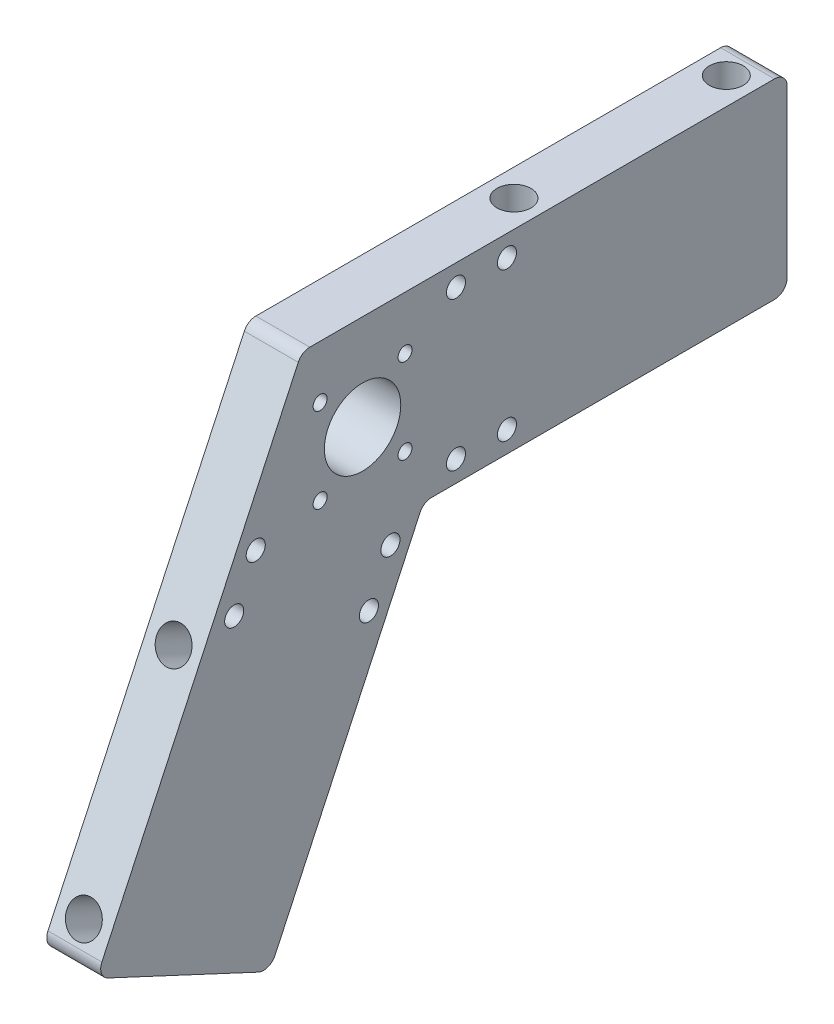
ISO-10303-21;
HEADER;
FILE_DESCRIPTION(('STEP AP214'),'2;1');
FILE_NAME('part.step','',(''),(''),'','','');
FILE_SCHEMA(('AUTOMOTIVE_DESIGN { 1 0 10303 214 1 1 1 1 }'));
ENDSEC;
DATA;
#1=APPLICATION_CONTEXT('core data for automotive mechanical design processes');
#2=APPLICATION_PROTOCOL_DEFINITION('international standard','automotive_design',2000,#1);
#3=PRODUCT_CONTEXT('',#1,'mechanical');
#4=PRODUCT('Part','Part','',(#3));
#5=PRODUCT_RELATED_PRODUCT_CATEGORY('part','',(#4));
#6=PRODUCT_DEFINITION_FORMATION('','',#4);
#7=PRODUCT_DEFINITION_CONTEXT('part definition',#1,'design');
#8=PRODUCT_DEFINITION('design','',#6,#7);
#9=PRODUCT_DEFINITION_SHAPE('','',#8);
#10=(LENGTH_UNIT() NAMED_UNIT(*) SI_UNIT(.MILLI.,.METRE.));
#11=(NAMED_UNIT(*) PLANE_ANGLE_UNIT() SI_UNIT($,.RADIAN.));
#12=(NAMED_UNIT(*) SI_UNIT($,.STERADIAN.) SOLID_ANGLE_UNIT());
#13=UNCERTAINTY_MEASURE_WITH_UNIT(LENGTH_MEASURE(1.E-05),#10,'distance_accuracy_value','');
#14=(GEOMETRIC_REPRESENTATION_CONTEXT(3) GLOBAL_UNCERTAINTY_ASSIGNED_CONTEXT((#13)) GLOBAL_UNIT_ASSIGNED_CONTEXT((#10,
#11,#12)) REPRESENTATION_CONTEXT('',''));
#15=CARTESIAN_POINT('',(0.,0.,0.));
#16=DIRECTION('',(0.,0.,1.));
#17=DIRECTION('',(1.,0.,0.));
#18=AXIS2_PLACEMENT_3D('',#15,#16,#17);
#19=CARTESIAN_POINT('',(6.35,22.5,14.3340808681685));
#20=DIRECTION('',(0.,-1.,0.));
#21=DIRECTION('',(0.,0.,-1.));
#22=AXIS2_PLACEMENT_3D('',#19,#20,#21);
#23=PLANE('',#22);
#24=DIRECTION('',(0.,0.,1.));
#25=VECTOR('',#24,1.);
#26=CARTESIAN_POINT('',(6.35,22.5,14.3340808681685));
#27=LINE('',#26,#25);
#28=CARTESIAN_POINT('',(6.35,22.5,-97.));
#29=VERTEX_POINT('',#28);
#30=CARTESIAN_POINT('',(6.35,22.5,12.4228700857461));
#31=VERTEX_POINT('',#30);
#32=EDGE_CURVE('E228',#29,#31,#27,.T.);
#33=ORIENTED_EDGE('',*,*,#32,.F.);
#34=DIRECTION('',(-1.,0.,0.));
#35=VECTOR('',#34,1.);
#36=CARTESIAN_POINT('',(6.35,22.5,-97.));
#37=LINE('',#36,#35);
#38=CARTESIAN_POINT('',(-6.35,22.5,-97.));
#39=VERTEX_POINT('',#38);
#40=EDGE_CURVE('E181',#29,#39,#37,.T.);
#41=ORIENTED_EDGE('',*,*,#40,.T.);
#42=DIRECTION('',(0.,0.,1.));
#43=VECTOR('',#42,1.);
#44=CARTESIAN_POINT('',(-6.35,22.5,14.3340808681685));
#45=LINE('',#44,#43);
#46=CARTESIAN_POINT('',(-6.35,22.5,12.4228700857461));
#47=VERTEX_POINT('',#46);
#48=EDGE_CURVE('E157',#39,#47,#45,.T.);
#49=ORIENTED_EDGE('',*,*,#48,.T.);
#50=DIRECTION('',(-1.,0.,0.));
#51=VECTOR('',#50,1.);
#52=CARTESIAN_POINT('',(6.35,22.5,12.4228700857461));
#53=LINE('',#52,#51);
#54=EDGE_CURVE('E179',#47,#31,#53,.F.);
#55=ORIENTED_EDGE('',*,*,#54,.T.);
#56=EDGE_LOOP('',(#33,#41,#49,#55));
#57=FACE_BOUND('',#56,.T.);
#58=CARTESIAN_POINT('',(0.,22.5,-42.));
#59=DIRECTION('',(0.,1.,0.));
#60=DIRECTION('',(0.,0.,1.));
#61=AXIS2_PLACEMENT_3D('',#58,#59,#60);
#62=CIRCLE('',#61,4.);
#63=CARTESIAN_POINT('',(0.,22.5,-38.));
#64=VERTEX_POINT('',#63);
#65=EDGE_CURVE('E252',#64,#64,#62,.T.);
#66=ORIENTED_EDGE('',*,*,#65,.F.);
#67=EDGE_LOOP('',(#66));
#68=FACE_BOUND('',#67,.T.);
#69=CARTESIAN_POINT('',(0.,22.5,-92.));
#70=DIRECTION('',(0.,1.,0.));
#71=DIRECTION('',(0.,0.,1.));
#72=AXIS2_PLACEMENT_3D('',#69,#70,#71);
#73=CIRCLE('',#72,4.);
#74=CARTESIAN_POINT('',(0.,22.5,-88.));
#75=VERTEX_POINT('',#74);
#76=EDGE_CURVE('E258',#75,#75,#73,.T.);
#77=ORIENTED_EDGE('',*,*,#76,.F.);
#78=EDGE_LOOP('',(#77));
#79=FACE_BOUND('',#78,.T.);
#80=ADVANCED_FACE('F37',(#57,#68,#79),#23,.F.);
#81=CARTESIAN_POINT('',(6.35,0.,0.));
#82=DIRECTION('',(-1.,0.,0.));
#83=DIRECTION('',(0.,0.,1.));
#84=AXIS2_PLACEMENT_3D('',#81,#82,#83);
#85=PLANE('',#84);
#86=CARTESIAN_POINT('',(6.35,-27.3345908952686,-6.56278451484589));
#87=DIRECTION('',(-1.,0.,0.));
#88=DIRECTION('',(0.,0.,1.));
#89=AXIS2_PLACEMENT_3D('',#86,#87,#88);
#90=CIRCLE('',#89,2.24999999999999);
#91=CARTESIAN_POINT('',(6.35,-27.3345908952686,-4.3127845148459));
#92=VERTEX_POINT('',#91);
#93=EDGE_CURVE('E339',#92,#92,#90,.T.);
#94=ORIENTED_EDGE('',*,*,#93,.T.);
#95=EDGE_LOOP('',(#94));
#96=FACE_BOUND('',#95,.T.);
#97=CARTESIAN_POINT('',(6.35,-38.2102843397084,-1.49136537395746));
#98=DIRECTION('',(-1.,0.,0.));
#99=DIRECTION('',(0.,0.,1.));
#100=AXIS2_PLACEMENT_3D('',#97,#98,#99);
#101=CIRCLE('',#100,2.24999999999999);
#102=CARTESIAN_POINT('',(6.35,-38.2102843397084,0.758634626042531));
#103=VERTEX_POINT('',#102);
#104=EDGE_CURVE('E333',#103,#103,#101,.T.);
#105=ORIENTED_EDGE('',*,*,#104,.T.);
#106=EDGE_LOOP('',(#105));
#107=FACE_BOUND('',#106,.T.);
#108=CARTESIAN_POINT('',(6.35,-12.5429517343439,25.1579880314368));
#109=DIRECTION('',(-1.,0.,0.));
#110=DIRECTION('',(0.,0.,1.));
#111=AXIS2_PLACEMENT_3D('',#108,#109,#110);
#112=CIRCLE('',#111,2.24999999999999);
#113=CARTESIAN_POINT('',(6.35,-12.5429517343439,27.4079880314368));
#114=VERTEX_POINT('',#113);
#115=EDGE_CURVE('E327',#114,#114,#112,.T.);
#116=ORIENTED_EDGE('',*,*,#115,.T.);
#117=EDGE_LOOP('',(#116));
#118=FACE_BOUND('',#117,.T.);
#119=CARTESIAN_POINT('',(6.35,-23.4186451787837,30.2294071723253));
#120=DIRECTION('',(-1.,0.,0.));
#121=DIRECTION('',(0.,0.,1.));
#122=AXIS2_PLACEMENT_3D('',#119,#120,#121);
#123=CIRCLE('',#122,2.24999999999999);
#124=CARTESIAN_POINT('',(6.35,-23.4186451787837,32.4794071723253));
#125=VERTEX_POINT('',#124);
#126=EDGE_CURVE('E321',#125,#125,#123,.T.);
#127=ORIENTED_EDGE('',*,*,#126,.T.);
#128=EDGE_LOOP('',(#127));
#129=FACE_BOUND('',#128,.T.);
#130=CARTESIAN_POINT('',(6.35,17.5,-22.));
#131=DIRECTION('',(-1.,0.,0.));
#132=DIRECTION('',(0.,0.,1.));
#133=AXIS2_PLACEMENT_3D('',#130,#131,#132);
#134=CIRCLE('',#133,2.24999999999999);
#135=CARTESIAN_POINT('',(6.35,17.5,-19.75));
#136=VERTEX_POINT('',#135);
#137=EDGE_CURVE('E315',#136,#136,#134,.T.);
#138=ORIENTED_EDGE('',*,*,#137,.T.);
#139=EDGE_LOOP('',(#138));
#140=FACE_BOUND('',#139,.T.);
#141=CARTESIAN_POINT('',(6.35,-17.5,-22.));
#142=DIRECTION('',(-1.,0.,0.));
#143=DIRECTION('',(0.,0.,1.));
#144=AXIS2_PLACEMENT_3D('',#141,#142,#143);
#145=CIRCLE('',#144,2.24999999999999);
#146=CARTESIAN_POINT('',(6.35,-17.5,-19.75));
#147=VERTEX_POINT('',#146);
#148=EDGE_CURVE('E309',#147,#147,#145,.T.);
#149=ORIENTED_EDGE('',*,*,#148,.T.);
#150=EDGE_LOOP('',(#149));
#151=FACE_BOUND('',#150,.T.);
#152=CARTESIAN_POINT('',(6.35,17.5,-34.));
#153=DIRECTION('',(-1.,0.,0.));
#154=DIRECTION('',(0.,0.,1.));
#155=AXIS2_PLACEMENT_3D('',#152,#153,#154);
#156=CIRCLE('',#155,2.24999999999999);
#157=CARTESIAN_POINT('',(6.35,17.5,-31.75));
#158=VERTEX_POINT('',#157);
#159=EDGE_CURVE('E303',#158,#158,#156,.T.);
#160=ORIENTED_EDGE('',*,*,#159,.T.);
#161=EDGE_LOOP('',(#160));
#162=FACE_BOUND('',#161,.T.);
#163=CARTESIAN_POINT('',(6.35,-17.5,-34.));
#164=DIRECTION('',(-1.,0.,0.));
#165=DIRECTION('',(0.,0.,1.));
#166=AXIS2_PLACEMENT_3D('',#163,#164,#165);
#167=CIRCLE('',#166,2.24999999999999);
#168=CARTESIAN_POINT('',(6.35,-17.5,-31.75));
#169=VERTEX_POINT('',#168);
#170=EDGE_CURVE('E297',#169,#169,#167,.T.);
#171=ORIENTED_EDGE('',*,*,#170,.T.);
#172=EDGE_LOOP('',(#171));
#173=FACE_BOUND('',#172,.T.);
#174=CARTESIAN_POINT('',(6.35,10.,10.));
#175=DIRECTION('',(-1.,0.,0.));
#176=DIRECTION('',(0.,0.,1.));
#177=AXIS2_PLACEMENT_3D('',#174,#175,#176);
#178=CIRCLE('',#177,1.65);
#179=CARTESIAN_POINT('',(6.35,10.,11.65));
#180=VERTEX_POINT('',#179);
#181=EDGE_CURVE('E291',#180,#180,#178,.T.);
#182=ORIENTED_EDGE('',*,*,#181,.T.);
#183=EDGE_LOOP('',(#182));
#184=FACE_BOUND('',#183,.T.);
#185=CARTESIAN_POINT('',(6.35,10.,-10.));
#186=DIRECTION('',(-1.,0.,0.));
#187=DIRECTION('',(0.,0.,1.));
#188=AXIS2_PLACEMENT_3D('',#185,#186,#187);
#189=CIRCLE('',#188,1.65);
#190=CARTESIAN_POINT('',(6.35,10.,-8.35));
#191=VERTEX_POINT('',#190);
#192=EDGE_CURVE('E285',#191,#191,#189,.T.);
#193=ORIENTED_EDGE('',*,*,#192,.T.);
#194=EDGE_LOOP('',(#193));
#195=FACE_BOUND('',#194,.T.);
#196=CARTESIAN_POINT('',(6.35,-10.,-10.));
#197=DIRECTION('',(-1.,0.,0.));
#198=DIRECTION('',(0.,0.,1.));
#199=AXIS2_PLACEMENT_3D('',#196,#197,#198);
#200=CIRCLE('',#199,1.65);
#201=CARTESIAN_POINT('',(6.35,-10.,-8.35));
#202=VERTEX_POINT('',#201);
#203=EDGE_CURVE('E279',#202,#202,#200,.T.);
#204=ORIENTED_EDGE('',*,*,#203,.T.);
#205=EDGE_LOOP('',(#204));
#206=FACE_BOUND('',#205,.T.);
#207=CARTESIAN_POINT('',(6.35,-10.,9.99999999999999));
#208=DIRECTION('',(-1.,0.,0.));
#209=DIRECTION('',(0.,0.,1.));
#210=AXIS2_PLACEMENT_3D('',#207,#208,#209);
#211=CIRCLE('',#210,1.65);
#212=CARTESIAN_POINT('',(6.35,-10.,11.65));
#213=VERTEX_POINT('',#212);
#214=EDGE_CURVE('E273',#213,#213,#211,.T.);
#215=ORIENTED_EDGE('',*,*,#214,.T.);
#216=EDGE_LOOP('',(#215));
#217=FACE_BOUND('',#216,.T.);
#218=DIRECTION('',(0.,1.,0.));
#219=VECTOR('',#218,1.);
#220=CARTESIAN_POINT('',(6.35,22.5,-100.));
#221=LINE('',#220,#219);
#222=CARTESIAN_POINT('',(6.35,-19.5,-100.));
#223=VERTEX_POINT('',#222);
#224=CARTESIAN_POINT('',(6.35,19.5,-100.));
#225=VERTEX_POINT('',#224);
#226=EDGE_CURVE('E244',#223,#225,#221,.T.);
#227=ORIENTED_EDGE('',*,*,#226,.T.);
#228=CARTESIAN_POINT('',(6.35,19.5,-97.));
#229=DIRECTION('',(-1.,0.,0.));
#230=DIRECTION('',(0.,0.,1.));
#231=AXIS2_PLACEMENT_3D('',#228,#229,#230);
#232=CIRCLE('',#231,3.);
#233=EDGE_CURVE('E205',#225,#29,#232,.F.);
#234=ORIENTED_EDGE('',*,*,#233,.T.);
#235=ORIENTED_EDGE('',*,*,#32,.T.);
#236=CARTESIAN_POINT('',(6.35,19.5,12.4228700857461));
#237=DIRECTION('',(-1.,0.,0.));
#238=DIRECTION('',(0.,0.,1.));
#239=AXIS2_PLACEMENT_3D('',#236,#237,#238);
#240=CIRCLE('',#239,3.);
#241=CARTESIAN_POINT('',(6.35,20.7678547852221,15.141793446856));
#242=VERTEX_POINT('',#241);
#243=EDGE_CURVE('E198',#31,#242,#240,.F.);
#244=ORIENTED_EDGE('',*,*,#243,.T.);
#245=DIRECTION('',(0.,-0.906307787036648,0.422618261740703));
#246=VECTOR('',#245,1.);
#247=CARTESIAN_POINT('',(6.35,22.5,14.3340808681685));
#248=LINE('',#247,#246);
#249=CARTESIAN_POINT('',(6.35,-78.4029444533891,61.3858965971728));
#250=VERTEX_POINT('',#249);
#251=EDGE_CURVE('E218',#242,#250,#248,.T.);
#252=ORIENTED_EDGE('',*,*,#251,.T.);
#253=CARTESIAN_POINT('',(6.35,-79.6707992386112,58.6669732360629));
#254=DIRECTION('',(-1.,0.,0.));
#255=DIRECTION('',(0.,0.,1.));
#256=AXIS2_PLACEMENT_3D('',#253,#254,#255);
#257=CIRCLE('',#256,3.);
#258=CARTESIAN_POINT('',(6.35,-82.3897225997211,59.934828021285));
#259=VERTEX_POINT('',#258);
#260=EDGE_CURVE('E59',#250,#259,#257,.F.);
#261=ORIENTED_EDGE('',*,*,#260,.T.);
#262=DIRECTION('',(0.,-0.422618261740703,-0.906307787036648));
#263=VECTOR('',#262,1.);
#264=CARTESIAN_POINT('',(6.35,-81.121867814499,62.6537513823949));
#265=LINE('',#264,#263);
#266=CARTESIAN_POINT('',(6.35,-98.8718348076085,24.5888243268557));
#267=VERTEX_POINT('',#266);
#268=EDGE_CURVE('E227',#259,#267,#265,.T.);
#269=ORIENTED_EDGE('',*,*,#268,.T.);
#270=CARTESIAN_POINT('',(6.35,-96.1529114464986,23.3209695416336));
#271=DIRECTION('',(-1.,0.,0.));
#272=DIRECTION('',(0.,0.,1.));
#273=AXIS2_PLACEMENT_3D('',#270,#271,#272);
#274=CIRCLE('',#273,3.);
#275=CARTESIAN_POINT('',(6.35,-97.4207662317207,20.6020461805236));
#276=VERTEX_POINT('',#275);
#277=EDGE_CURVE('E201',#267,#276,#274,.F.);
#278=ORIENTED_EDGE('',*,*,#277,.T.);
#279=DIRECTION('',(0.,0.906307787036648,-0.422618261740703));
#280=VECTOR('',#279,1.);
#281=CARTESIAN_POINT('',(6.35,-22.5,-14.3340808681685));
#282=LINE('',#281,#280);
#283=CARTESIAN_POINT('',(6.35,-24.2321452147779,-13.5263682894811));
#284=VERTEX_POINT('',#283);
#285=EDGE_CURVE('E163',#276,#284,#282,.T.);
#286=ORIENTED_EDGE('',*,*,#285,.T.);
#287=CARTESIAN_POINT('',(6.35,-25.5,-16.245291650591));
#288=DIRECTION('',(-1.,0.,0.));
#289=DIRECTION('',(0.,0.,1.));
#290=AXIS2_PLACEMENT_3D('',#287,#288,#289);
#291=CIRCLE('',#290,3.);
#292=CARTESIAN_POINT('',(6.35,-22.5,-16.245291650591));
#293=VERTEX_POINT('',#292);
#294=EDGE_CURVE('E11',#284,#293,#291,.T.);
#295=ORIENTED_EDGE('',*,*,#294,.T.);
#296=DIRECTION('',(0.,0.,-1.));
#297=VECTOR('',#296,1.);
#298=CARTESIAN_POINT('',(6.35,-22.5,-14.3340808681685));
#299=LINE('',#298,#297);
#300=CARTESIAN_POINT('',(6.35,-22.5,-97.));
#301=VERTEX_POINT('',#300);
#302=EDGE_CURVE('E144',#293,#301,#299,.T.);
#303=ORIENTED_EDGE('',*,*,#302,.T.);
#304=CARTESIAN_POINT('',(6.35,-19.5,-97.));
#305=DIRECTION('',(-1.,0.,0.));
#306=DIRECTION('',(0.,0.,1.));
#307=AXIS2_PLACEMENT_3D('',#304,#305,#306);
#308=CIRCLE('',#307,3.);
#309=EDGE_CURVE('E203',#301,#223,#308,.F.);
#310=ORIENTED_EDGE('',*,*,#309,.T.);
#311=EDGE_LOOP('',(#227,#234,#235,#244,#252,#261,#269,#278,#286,#295,#303,#310));
#312=FACE_BOUND('',#311,.T.);
#313=CARTESIAN_POINT('',(6.35,0.,0.));
#314=DIRECTION('',(1.,0.,0.));
#315=DIRECTION('',(0.,0.,-1.));
#316=AXIS2_PLACEMENT_3D('',#313,#314,#315);
#317=CIRCLE('',#316,9.);
#318=CARTESIAN_POINT('',(6.35,0.,-9.));
#319=VERTEX_POINT('',#318);
#320=EDGE_CURVE('E154',#319,#319,#317,.T.);
#321=ORIENTED_EDGE('',*,*,#320,.F.);
#322=EDGE_LOOP('',(#321));
#323=FACE_BOUND('',#322,.T.);
#324=ADVANCED_FACE('F223',(#96,#107,#118,#129,#140,#151,#162,#173,#184,#195,#206,#217,#312,
#323),#85,.F.);
#325=CARTESIAN_POINT('',(-6.35,0.,0.));
#326=DIRECTION('',(-1.,0.,0.));
#327=DIRECTION('',(0.,0.,1.));
#328=AXIS2_PLACEMENT_3D('',#325,#326,#327);
#329=PLANE('',#328);
#330=CARTESIAN_POINT('',(-6.35,-27.3345908952686,-6.56278451484589));
#331=DIRECTION('',(-1.,0.,0.));
#332=DIRECTION('',(0.,0.,1.));
#333=AXIS2_PLACEMENT_3D('',#330,#331,#332);
#334=CIRCLE('',#333,2.24999999999999);
#335=CARTESIAN_POINT('',(-6.35,-27.3345908952686,-4.31278451484591));
#336=VERTEX_POINT('',#335);
#337=EDGE_CURVE('E342',#336,#336,#334,.T.);
#338=ORIENTED_EDGE('',*,*,#337,.F.);
#339=EDGE_LOOP('',(#338));
#340=FACE_BOUND('',#339,.T.);
#341=CARTESIAN_POINT('',(-6.35,-38.2102843397084,-1.49136537395746));
#342=DIRECTION('',(-1.,0.,0.));
#343=DIRECTION('',(0.,0.,1.));
#344=AXIS2_PLACEMENT_3D('',#341,#342,#343);
#345=CIRCLE('',#344,2.24999999999999);
#346=CARTESIAN_POINT('',(-6.35,-38.2102843397084,0.758634626042528));
#347=VERTEX_POINT('',#346);
#348=EDGE_CURVE('E336',#347,#347,#345,.T.);
#349=ORIENTED_EDGE('',*,*,#348,.F.);
#350=EDGE_LOOP('',(#349));
#351=FACE_BOUND('',#350,.T.);
#352=CARTESIAN_POINT('',(-6.35,-12.5429517343439,25.1579880314368));
#353=DIRECTION('',(-1.,0.,0.));
#354=DIRECTION('',(0.,0.,1.));
#355=AXIS2_PLACEMENT_3D('',#352,#353,#354);
#356=CIRCLE('',#355,2.24999999999999);
#357=CARTESIAN_POINT('',(-6.35,-12.5429517343439,27.4079880314368));
#358=VERTEX_POINT('',#357);
#359=EDGE_CURVE('E330',#358,#358,#356,.T.);
#360=ORIENTED_EDGE('',*,*,#359,.F.);
#361=EDGE_LOOP('',(#360));
#362=FACE_BOUND('',#361,.T.);
#363=CARTESIAN_POINT('',(-6.35,-23.4186451787837,30.2294071723253));
#364=DIRECTION('',(-1.,0.,0.));
#365=DIRECTION('',(0.,0.,1.));
#366=AXIS2_PLACEMENT_3D('',#363,#364,#365);
#367=CIRCLE('',#366,2.24999999999999);
#368=CARTESIAN_POINT('',(-6.35,-23.4186451787837,32.4794071723253));
#369=VERTEX_POINT('',#368);
#370=EDGE_CURVE('E324',#369,#369,#367,.T.);
#371=ORIENTED_EDGE('',*,*,#370,.F.);
#372=EDGE_LOOP('',(#371));
#373=FACE_BOUND('',#372,.T.);
#374=CARTESIAN_POINT('',(-6.35,17.5,-22.));
#375=DIRECTION('',(-1.,0.,0.));
#376=DIRECTION('',(0.,0.,1.));
#377=AXIS2_PLACEMENT_3D('',#374,#375,#376);
#378=CIRCLE('',#377,2.24999999999999);
#379=CARTESIAN_POINT('',(-6.35,17.5,-19.75));
#380=VERTEX_POINT('',#379);
#381=EDGE_CURVE('E318',#380,#380,#378,.T.);
#382=ORIENTED_EDGE('',*,*,#381,.F.);
#383=EDGE_LOOP('',(#382));
#384=FACE_BOUND('',#383,.T.);
#385=CARTESIAN_POINT('',(-6.35,-17.5,-22.));
#386=DIRECTION('',(-1.,0.,0.));
#387=DIRECTION('',(0.,0.,1.));
#388=AXIS2_PLACEMENT_3D('',#385,#386,#387);
#389=CIRCLE('',#388,2.24999999999999);
#390=CARTESIAN_POINT('',(-6.35,-17.5,-19.75));
#391=VERTEX_POINT('',#390);
#392=EDGE_CURVE('E312',#391,#391,#389,.T.);
#393=ORIENTED_EDGE('',*,*,#392,.F.);
#394=EDGE_LOOP('',(#393));
#395=FACE_BOUND('',#394,.T.);
#396=CARTESIAN_POINT('',(-6.35,17.5,-34.));
#397=DIRECTION('',(-1.,0.,0.));
#398=DIRECTION('',(0.,0.,1.));
#399=AXIS2_PLACEMENT_3D('',#396,#397,#398);
#400=CIRCLE('',#399,2.24999999999999);
#401=CARTESIAN_POINT('',(-6.35,17.5,-31.75));
#402=VERTEX_POINT('',#401);
#403=EDGE_CURVE('E306',#402,#402,#400,.T.);
#404=ORIENTED_EDGE('',*,*,#403,.F.);
#405=EDGE_LOOP('',(#404));
#406=FACE_BOUND('',#405,.T.);
#407=CARTESIAN_POINT('',(-6.35,-17.5,-34.));
#408=DIRECTION('',(-1.,0.,0.));
#409=DIRECTION('',(0.,0.,1.));
#410=AXIS2_PLACEMENT_3D('',#407,#408,#409);
#411=CIRCLE('',#410,2.24999999999999);
#412=CARTESIAN_POINT('',(-6.35,-17.5,-31.75));
#413=VERTEX_POINT('',#412);
#414=EDGE_CURVE('E300',#413,#413,#411,.T.);
#415=ORIENTED_EDGE('',*,*,#414,.F.);
#416=EDGE_LOOP('',(#415));
#417=FACE_BOUND('',#416,.T.);
#418=CARTESIAN_POINT('',(-6.35,10.,10.));
#419=DIRECTION('',(-1.,0.,0.));
#420=DIRECTION('',(0.,0.,1.));
#421=AXIS2_PLACEMENT_3D('',#418,#419,#420);
#422=CIRCLE('',#421,1.65);
#423=CARTESIAN_POINT('',(-6.35,10.,11.65));
#424=VERTEX_POINT('',#423);
#425=EDGE_CURVE('E294',#424,#424,#422,.T.);
#426=ORIENTED_EDGE('',*,*,#425,.F.);
#427=EDGE_LOOP('',(#426));
#428=FACE_BOUND('',#427,.T.);
#429=CARTESIAN_POINT('',(-6.35,10.,-10.));
#430=DIRECTION('',(-1.,0.,0.));
#431=DIRECTION('',(0.,0.,1.));
#432=AXIS2_PLACEMENT_3D('',#429,#430,#431);
#433=CIRCLE('',#432,1.65);
#434=CARTESIAN_POINT('',(-6.35,10.,-8.35));
#435=VERTEX_POINT('',#434);
#436=EDGE_CURVE('E288',#435,#435,#433,.T.);
#437=ORIENTED_EDGE('',*,*,#436,.F.);
#438=EDGE_LOOP('',(#437));
#439=FACE_BOUND('',#438,.T.);
#440=CARTESIAN_POINT('',(-6.35,-10.,-10.));
#441=DIRECTION('',(-1.,0.,0.));
#442=DIRECTION('',(0.,0.,1.));
#443=AXIS2_PLACEMENT_3D('',#440,#441,#442);
#444=CIRCLE('',#443,1.65);
#445=CARTESIAN_POINT('',(-6.35,-10.,-8.35));
#446=VERTEX_POINT('',#445);
#447=EDGE_CURVE('E282',#446,#446,#444,.T.);
#448=ORIENTED_EDGE('',*,*,#447,.F.);
#449=EDGE_LOOP('',(#448));
#450=FACE_BOUND('',#449,.T.);
#451=CARTESIAN_POINT('',(-6.35,-10.,9.99999999999999));
#452=DIRECTION('',(-1.,0.,0.));
#453=DIRECTION('',(0.,0.,1.));
#454=AXIS2_PLACEMENT_3D('',#451,#452,#453);
#455=CIRCLE('',#454,1.65);
#456=CARTESIAN_POINT('',(-6.35,-10.,11.65));
#457=VERTEX_POINT('',#456);
#458=EDGE_CURVE('E276',#457,#457,#455,.T.);
#459=ORIENTED_EDGE('',*,*,#458,.F.);
#460=EDGE_LOOP('',(#459));
#461=FACE_BOUND('',#460,.T.);
#462=ORIENTED_EDGE('',*,*,#48,.F.);
#463=CARTESIAN_POINT('',(-6.35,19.5,-97.));
#464=DIRECTION('',(-1.,0.,0.));
#465=DIRECTION('',(0.,0.,1.));
#466=AXIS2_PLACEMENT_3D('',#463,#464,#465);
#467=CIRCLE('',#466,3.);
#468=CARTESIAN_POINT('',(-6.35,19.5,-100.));
#469=VERTEX_POINT('',#468);
#470=EDGE_CURVE('E191',#39,#469,#467,.T.);
#471=ORIENTED_EDGE('',*,*,#470,.T.);
#472=DIRECTION('',(0.,1.,0.));
#473=VECTOR('',#472,1.);
#474=CARTESIAN_POINT('',(-6.35,22.5,-100.));
#475=LINE('',#474,#473);
#476=CARTESIAN_POINT('',(-6.35,-19.5,-100.));
#477=VERTEX_POINT('',#476);
#478=EDGE_CURVE('E153',#477,#469,#475,.T.);
#479=ORIENTED_EDGE('',*,*,#478,.F.);
#480=CARTESIAN_POINT('',(-6.35,-19.5,-97.));
#481=DIRECTION('',(-1.,0.,0.));
#482=DIRECTION('',(0.,0.,1.));
#483=AXIS2_PLACEMENT_3D('',#480,#481,#482);
#484=CIRCLE('',#483,3.);
#485=CARTESIAN_POINT('',(-6.35,-22.5,-97.));
#486=VERTEX_POINT('',#485);
#487=EDGE_CURVE('E152',#477,#486,#484,.T.);
#488=ORIENTED_EDGE('',*,*,#487,.T.);
#489=DIRECTION('',(0.,0.,-1.));
#490=VECTOR('',#489,1.);
#491=CARTESIAN_POINT('',(-6.35,-22.5,-14.3340808681685));
#492=LINE('',#491,#490);
#493=CARTESIAN_POINT('',(-6.35,-22.5,-16.245291650591));
#494=VERTEX_POINT('',#493);
#495=EDGE_CURVE('E141',#494,#486,#492,.T.);
#496=ORIENTED_EDGE('',*,*,#495,.F.);
#497=CARTESIAN_POINT('',(-6.35,-25.5,-16.245291650591));
#498=DIRECTION('',(-1.,0.,0.));
#499=DIRECTION('',(0.,0.,1.));
#500=AXIS2_PLACEMENT_3D('',#497,#498,#499);
#501=CIRCLE('',#500,3.);
#502=CARTESIAN_POINT('',(-6.35,-24.2321452147779,-13.5263682894811));
#503=VERTEX_POINT('',#502);
#504=EDGE_CURVE('E45',#494,#503,#501,.F.);
#505=ORIENTED_EDGE('',*,*,#504,.T.);
#506=DIRECTION('',(0.,0.906307787036648,-0.422618261740703));
#507=VECTOR('',#506,1.);
#508=CARTESIAN_POINT('',(-6.35,-22.5,-14.3340808681685));
#509=LINE('',#508,#507);
#510=CARTESIAN_POINT('',(-6.35,-97.4207662317207,20.6020461805236));
#511=VERTEX_POINT('',#510);
#512=EDGE_CURVE('E173',#511,#503,#509,.T.);
#513=ORIENTED_EDGE('',*,*,#512,.F.);
#514=CARTESIAN_POINT('',(-6.35,-96.1529114464986,23.3209695416336));
#515=DIRECTION('',(-1.,0.,0.));
#516=DIRECTION('',(0.,0.,1.));
#517=AXIS2_PLACEMENT_3D('',#514,#515,#516);
#518=CIRCLE('',#517,3.);
#519=CARTESIAN_POINT('',(-6.35,-98.8718348076085,24.5888243268557));
#520=VERTEX_POINT('',#519);
#521=EDGE_CURVE('E188',#511,#520,#518,.T.);
#522=ORIENTED_EDGE('',*,*,#521,.T.);
#523=DIRECTION('',(0.,-0.422618261740703,-0.906307787036648));
#524=VECTOR('',#523,1.);
#525=CARTESIAN_POINT('',(-6.35,-81.121867814499,62.6537513823949));
#526=LINE('',#525,#524);
#527=CARTESIAN_POINT('',(-6.35,-82.3897225997211,59.934828021285));
#528=VERTEX_POINT('',#527);
#529=EDGE_CURVE('E171',#528,#520,#526,.T.);
#530=ORIENTED_EDGE('',*,*,#529,.F.);
#531=CARTESIAN_POINT('',(-6.35,-79.6707992386112,58.6669732360629));
#532=DIRECTION('',(-1.,0.,0.));
#533=DIRECTION('',(0.,0.,1.));
#534=AXIS2_PLACEMENT_3D('',#531,#532,#533);
#535=CIRCLE('',#534,3.);
#536=CARTESIAN_POINT('',(-6.35,-78.4029444533891,61.3858965971728));
#537=VERTEX_POINT('',#536);
#538=EDGE_CURVE('E186',#528,#537,#535,.T.);
#539=ORIENTED_EDGE('',*,*,#538,.T.);
#540=DIRECTION('',(0.,-0.906307787036648,0.422618261740703));
#541=VECTOR('',#540,1.);
#542=CARTESIAN_POINT('',(-6.35,22.5,14.3340808681685));
#543=LINE('',#542,#541);
#544=CARTESIAN_POINT('',(-6.35,20.7678547852221,15.141793446856));
#545=VERTEX_POINT('',#544);
#546=EDGE_CURVE('E168',#545,#537,#543,.T.);
#547=ORIENTED_EDGE('',*,*,#546,.F.);
#548=CARTESIAN_POINT('',(-6.35,19.5,12.4228700857461));
#549=DIRECTION('',(-1.,0.,0.));
#550=DIRECTION('',(0.,0.,1.));
#551=AXIS2_PLACEMENT_3D('',#548,#549,#550);
#552=CIRCLE('',#551,3.);
#553=EDGE_CURVE('E184',#545,#47,#552,.T.);
#554=ORIENTED_EDGE('',*,*,#553,.T.);
#555=EDGE_LOOP('',(#462,#471,#479,#488,#496,#505,#513,#522,#530,#539,#547,#554));
#556=FACE_BOUND('',#555,.T.);
#557=CARTESIAN_POINT('',(-6.35,0.,0.));
#558=DIRECTION('',(1.,0.,0.));
#559=DIRECTION('',(0.,0.,-1.));
#560=AXIS2_PLACEMENT_3D('',#557,#558,#559);
#561=CIRCLE('',#560,9.);
#562=CARTESIAN_POINT('',(-6.35,0.,-9.));
#563=VERTEX_POINT('',#562);
#564=EDGE_CURVE('E160',#563,#563,#561,.T.);
#565=ORIENTED_EDGE('',*,*,#564,.T.);
#566=EDGE_LOOP('',(#565));
#567=FACE_BOUND('',#566,.T.);
#568=ADVANCED_FACE('F149',(#340,#351,#362,#373,#384,#395,#406,#417,#428,#439,#450,#461,#556,
#567),#329,.T.);
#569=CARTESIAN_POINT('',(6.35,-22.5,-14.3340808681685));
#570=DIRECTION('',(0.,1.,0.));
#571=DIRECTION('',(0.,0.,1.));
#572=AXIS2_PLACEMENT_3D('',#569,#570,#571);
#573=PLANE('',#572);
#574=CARTESIAN_POINT('',(0.,-22.5,-92.));
#575=DIRECTION('',(0.,1.,0.));
#576=DIRECTION('',(0.,0.,1.));
#577=AXIS2_PLACEMENT_3D('',#574,#575,#576);
#578=CIRCLE('',#577,3.99999999999999);
#579=CARTESIAN_POINT('',(0.,-22.5,-88.));
#580=VERTEX_POINT('',#579);
#581=EDGE_CURVE('E255',#580,#580,#578,.T.);
#582=ORIENTED_EDGE('',*,*,#581,.T.);
#583=EDGE_LOOP('',(#582));
#584=FACE_BOUND('',#583,.T.);
#585=CARTESIAN_POINT('',(0.,-22.5,-42.));
#586=DIRECTION('',(0.,1.,0.));
#587=DIRECTION('',(0.,0.,1.));
#588=AXIS2_PLACEMENT_3D('',#585,#586,#587);
#589=CIRCLE('',#588,3.99999999999999);
#590=CARTESIAN_POINT('',(0.,-22.5,-38.));
#591=VERTEX_POINT('',#590);
#592=EDGE_CURVE('E248',#591,#591,#589,.T.);
#593=ORIENTED_EDGE('',*,*,#592,.T.);
#594=EDGE_LOOP('',(#593));
#595=FACE_BOUND('',#594,.T.);
#596=ORIENTED_EDGE('',*,*,#302,.F.);
#597=DIRECTION('',(-1.,0.,0.));
#598=VECTOR('',#597,1.);
#599=CARTESIAN_POINT('',(-6.35,-22.5,-16.245291650591));
#600=LINE('',#599,#598);
#601=EDGE_CURVE('E130',#293,#494,#600,.T.);
#602=ORIENTED_EDGE('',*,*,#601,.T.);
#603=ORIENTED_EDGE('',*,*,#495,.T.);
#604=DIRECTION('',(-1.,0.,0.));
#605=VECTOR('',#604,1.);
#606=CARTESIAN_POINT('',(6.35,-22.5,-97.));
#607=LINE('',#606,#605);
#608=EDGE_CURVE('E146',#486,#301,#607,.F.);
#609=ORIENTED_EDGE('',*,*,#608,.T.);
#610=EDGE_LOOP('',(#596,#602,#603,#609));
#611=FACE_BOUND('',#610,.T.);
#612=ADVANCED_FACE('F140',(#584,#595,#611),#573,.F.);
#613=CARTESIAN_POINT('',(6.35,22.5,-100.));
#614=DIRECTION('',(0.,0.,1.));
#615=DIRECTION('',(1.,0.,0.));
#616=AXIS2_PLACEMENT_3D('',#613,#614,#615);
#617=PLANE('',#616);
#618=ORIENTED_EDGE('',*,*,#478,.T.);
#619=DIRECTION('',(-1.,0.,0.));
#620=VECTOR('',#619,1.);
#621=CARTESIAN_POINT('',(6.35,19.5,-100.));
#622=LINE('',#621,#620);
#623=EDGE_CURVE('E196',#469,#225,#622,.F.);
#624=ORIENTED_EDGE('',*,*,#623,.T.);
#625=ORIENTED_EDGE('',*,*,#226,.F.);
#626=DIRECTION('',(-1.,0.,0.));
#627=VECTOR('',#626,1.);
#628=CARTESIAN_POINT('',(6.35,-19.5,-100.));
#629=LINE('',#628,#627);
#630=EDGE_CURVE('E193',#223,#477,#629,.T.);
#631=ORIENTED_EDGE('',*,*,#630,.T.);
#632=EDGE_LOOP('',(#618,#624,#625,#631));
#633=FACE_BOUND('',#632,.T.);
#634=ADVANCED_FACE('F401',(#633),#617,.F.);
#635=CARTESIAN_POINT('',(6.35,22.5,14.3340808681685));
#636=DIRECTION('',(0.,-0.422618261740703,-0.906307787036648));
#637=DIRECTION('',(0.,0.906307787036648,-0.422618261740703));
#638=AXIS2_PLACEMENT_3D('',#635,#636,#637);
#639=PLANE('',#638);
#640=CARTESIAN_POINT('',(0.,-28.5560161663734,38.1418922014341));
#641=DIRECTION('',(0.,0.422618261740703,0.906307787036648));
#642=DIRECTION('',(0.,-0.906307787036648,0.422618261740703));
#643=AXIS2_PLACEMENT_3D('',#640,#641,#642);
#644=CIRCLE('',#643,4.);
#645=CARTESIAN_POINT('',(0.,-32.18124731452,39.832365248397));
#646=VERTEX_POINT('',#645);
#647=EDGE_CURVE('E270',#646,#646,#644,.T.);
#648=ORIENTED_EDGE('',*,*,#647,.F.);
#649=EDGE_LOOP('',(#648));
#650=FACE_BOUND('',#649,.T.);
#651=CARTESIAN_POINT('',(0.,-73.8714055182058,59.2728052884693));
#652=DIRECTION('',(0.,0.422618261740703,0.906307787036648));
#653=DIRECTION('',(0.,-0.906307787036648,0.422618261740703));
#654=AXIS2_PLACEMENT_3D('',#651,#652,#653);
#655=CIRCLE('',#654,4.);
#656=CARTESIAN_POINT('',(0.,-77.4966366663524,60.9632783354321));
#657=VERTEX_POINT('',#656);
#658=EDGE_CURVE('E264',#657,#657,#655,.T.);
#659=ORIENTED_EDGE('',*,*,#658,.F.);
#660=EDGE_LOOP('',(#659));
#661=FACE_BOUND('',#660,.T.);
#662=ORIENTED_EDGE('',*,*,#546,.T.);
#663=DIRECTION('',(-1.,0.,0.));
#664=VECTOR('',#663,1.);
#665=CARTESIAN_POINT('',(6.35,-78.4029444533891,61.3858965971728));
#666=LINE('',#665,#664);
#667=EDGE_CURVE('E136',#537,#250,#666,.F.);
#668=ORIENTED_EDGE('',*,*,#667,.T.);
#669=ORIENTED_EDGE('',*,*,#251,.F.);
#670=DIRECTION('',(-1.,0.,0.));
#671=VECTOR('',#670,1.);
#672=CARTESIAN_POINT('',(6.35,20.7678547852221,15.141793446856));
#673=LINE('',#672,#671);
#674=EDGE_CURVE('E211',#242,#545,#673,.T.);
#675=ORIENTED_EDGE('',*,*,#674,.T.);
#676=EDGE_LOOP('',(#662,#668,#669,#675));
#677=FACE_BOUND('',#676,.T.);
#678=ADVANCED_FACE('F217',(#650,#661,#677),#639,.F.);
#679=CARTESIAN_POINT('',(6.35,-81.121867814499,62.6537513823949));
#680=DIRECTION('',(0.,0.906307787036648,-0.422618261740703));
#681=DIRECTION('',(0.,0.422618261740703,0.906307787036648));
#682=AXIS2_PLACEMENT_3D('',#679,#680,#681);
#683=PLANE('',#682);
#684=ORIENTED_EDGE('',*,*,#529,.T.);
#685=DIRECTION('',(-1.,0.,0.));
#686=VECTOR('',#685,1.);
#687=CARTESIAN_POINT('',(6.35,-98.8718348076085,24.5888243268557));
#688=LINE('',#687,#686);
#689=EDGE_CURVE('E52',#520,#267,#688,.F.);
#690=ORIENTED_EDGE('',*,*,#689,.T.);
#691=ORIENTED_EDGE('',*,*,#268,.F.);
#692=DIRECTION('',(-1.,0.,0.));
#693=VECTOR('',#692,1.);
#694=CARTESIAN_POINT('',(6.35,-82.3897225997211,59.934828021285));
#695=LINE('',#694,#693);
#696=EDGE_CURVE('E207',#259,#528,#695,.T.);
#697=ORIENTED_EDGE('',*,*,#696,.T.);
#698=EDGE_LOOP('',(#684,#690,#691,#697));
#699=FACE_BOUND('',#698,.T.);
#700=ADVANCED_FACE('F233',(#699),#683,.F.);
#701=CARTESIAN_POINT('',(6.35,-22.5,-14.3340808681685));
#702=DIRECTION('',(0.,0.422618261740703,0.906307787036648));
#703=DIRECTION('',(0.,-0.906307787036648,0.422618261740703));
#704=AXIS2_PLACEMENT_3D('',#701,#702,#703);
#705=PLANE('',#704);
#706=CARTESIAN_POINT('',(0.,-47.5738379447051,-2.64195821521503));
#707=DIRECTION('',(0.,0.422618261740703,0.906307787036648));
#708=DIRECTION('',(0.,-0.906307787036648,0.422618261740703));
#709=AXIS2_PLACEMENT_3D('',#706,#707,#708);
#710=CIRCLE('',#709,3.99999999999999);
#711=CARTESIAN_POINT('',(0.,-51.1990690928517,-0.951485168252216));
#712=VERTEX_POINT('',#711);
#713=EDGE_CURVE('E267',#712,#712,#710,.T.);
#714=ORIENTED_EDGE('',*,*,#713,.T.);
#715=EDGE_LOOP('',(#714));
#716=FACE_BOUND('',#715,.T.);
#717=CARTESIAN_POINT('',(0.,-92.8892272965375,18.4889548718201));
#718=DIRECTION('',(0.,0.422618261740703,0.906307787036648));
#719=DIRECTION('',(0.,-0.906307787036648,0.422618261740703));
#720=AXIS2_PLACEMENT_3D('',#717,#718,#719);
#721=CIRCLE('',#720,3.99999999999999);
#722=CARTESIAN_POINT('',(0.,-96.5144584446841,20.1794279187829));
#723=VERTEX_POINT('',#722);
#724=EDGE_CURVE('E261',#723,#723,#721,.T.);
#725=ORIENTED_EDGE('',*,*,#724,.T.);
#726=EDGE_LOOP('',(#725));
#727=FACE_BOUND('',#726,.T.);
#728=ORIENTED_EDGE('',*,*,#512,.T.);
#729=DIRECTION('',(-1.,0.,0.));
#730=VECTOR('',#729,1.);
#731=CARTESIAN_POINT('',(6.35,-24.2321452147779,-13.5263682894811));
#732=LINE('',#731,#730);
#733=EDGE_CURVE('E131',#503,#284,#732,.F.);
#734=ORIENTED_EDGE('',*,*,#733,.T.);
#735=ORIENTED_EDGE('',*,*,#285,.F.);
#736=DIRECTION('',(-1.,0.,0.));
#737=VECTOR('',#736,1.);
#738=CARTESIAN_POINT('',(6.35,-97.4207662317207,20.6020461805236));
#739=LINE('',#738,#737);
#740=EDGE_CURVE('E145',#276,#511,#739,.T.);
#741=ORIENTED_EDGE('',*,*,#740,.T.);
#742=EDGE_LOOP('',(#728,#734,#735,#741));
#743=FACE_BOUND('',#742,.T.);
#744=ADVANCED_FACE('F240',(#716,#727,#743),#705,.F.);
#745=CARTESIAN_POINT('',(6.35,0.,0.));
#746=DIRECTION('',(-1.,0.,0.));
#747=DIRECTION('',(0.,0.,1.));
#748=AXIS2_PLACEMENT_3D('',#745,#746,#747);
#749=CYLINDRICAL_SURFACE('',#748,9.);
#750=ORIENTED_EDGE('',*,*,#320,.T.);
#751=EDGE_LOOP('',(#750));
#752=FACE_BOUND('',#751,.T.);
#753=ORIENTED_EDGE('',*,*,#564,.F.);
#754=EDGE_LOOP('',(#753));
#755=FACE_BOUND('',#754,.T.);
#756=ADVANCED_FACE('F646',(#752,#755),#749,.F.);
#757=CARTESIAN_POINT('',(0.,22.5,-42.));
#758=DIRECTION('',(0.,1.,0.));
#759=DIRECTION('',(0.,0.,1.));
#760=AXIS2_PLACEMENT_3D('',#757,#758,#759);
#761=CYLINDRICAL_SURFACE('',#760,3.99999999999999);
#762=ORIENTED_EDGE('',*,*,#592,.F.);
#763=EDGE_LOOP('',(#762));
#764=FACE_BOUND('',#763,.T.);
#765=ORIENTED_EDGE('',*,*,#65,.T.);
#766=EDGE_LOOP('',(#765));
#767=FACE_BOUND('',#766,.T.);
#768=ADVANCED_FACE('F656',(#764,#767),#761,.F.);
#769=CARTESIAN_POINT('',(0.,22.5,-92.));
#770=DIRECTION('',(0.,1.,0.));
#771=DIRECTION('',(0.,0.,1.));
#772=AXIS2_PLACEMENT_3D('',#769,#770,#771);
#773=CYLINDRICAL_SURFACE('',#772,3.99999999999999);
#774=ORIENTED_EDGE('',*,*,#581,.F.);
#775=EDGE_LOOP('',(#774));
#776=FACE_BOUND('',#775,.T.);
#777=ORIENTED_EDGE('',*,*,#76,.T.);
#778=EDGE_LOOP('',(#777));
#779=FACE_BOUND('',#778,.T.);
#780=ADVANCED_FACE('F670',(#776,#779),#773,.F.);
#781=CARTESIAN_POINT('',(0.,-73.8714055182058,59.2728052884693));
#782=DIRECTION('',(0.,0.422618261740703,0.906307787036648));
#783=DIRECTION('',(0.,-0.906307787036648,0.422618261740703));
#784=AXIS2_PLACEMENT_3D('',#781,#782,#783);
#785=CYLINDRICAL_SURFACE('',#784,3.99999999999999);
#786=ORIENTED_EDGE('',*,*,#724,.F.);
#787=EDGE_LOOP('',(#786));
#788=FACE_BOUND('',#787,.T.);
#789=ORIENTED_EDGE('',*,*,#658,.T.);
#790=EDGE_LOOP('',(#789));
#791=FACE_BOUND('',#790,.T.);
#792=ADVANCED_FACE('F679',(#788,#791),#785,.F.);
#793=CARTESIAN_POINT('',(0.,-28.5560161663734,38.1418922014341));
#794=DIRECTION('',(0.,0.422618261740703,0.906307787036648));
#795=DIRECTION('',(0.,-0.906307787036648,0.422618261740703));
#796=AXIS2_PLACEMENT_3D('',#793,#794,#795);
#797=CYLINDRICAL_SURFACE('',#796,3.99999999999999);
#798=ORIENTED_EDGE('',*,*,#713,.F.);
#799=EDGE_LOOP('',(#798));
#800=FACE_BOUND('',#799,.T.);
#801=ORIENTED_EDGE('',*,*,#647,.T.);
#802=EDGE_LOOP('',(#801));
#803=FACE_BOUND('',#802,.T.);
#804=ADVANCED_FACE('F411',(#800,#803),#797,.F.);
#805=CARTESIAN_POINT('',(6.35,-25.5,-16.245291650591));
#806=DIRECTION('',(1.,0.,0.));
#807=DIRECTION('',(0.,0.,-1.));
#808=AXIS2_PLACEMENT_3D('',#805,#806,#807);
#809=CYLINDRICAL_SURFACE('',#808,3.);
#810=ORIENTED_EDGE('',*,*,#294,.F.);
#811=ORIENTED_EDGE('',*,*,#733,.F.);
#812=ORIENTED_EDGE('',*,*,#504,.F.);
#813=ORIENTED_EDGE('',*,*,#601,.F.);
#814=EDGE_LOOP('',(#810,#811,#812,#813));
#815=FACE_BOUND('',#814,.T.);
#816=ADVANCED_FACE('F129',(#815),#809,.F.);
#817=CARTESIAN_POINT('',(6.35,19.5,-97.));
#818=DIRECTION('',(-1.,0.,0.));
#819=DIRECTION('',(0.,0.,1.));
#820=AXIS2_PLACEMENT_3D('',#817,#818,#819);
#821=CYLINDRICAL_SURFACE('',#820,3.);
#822=ORIENTED_EDGE('',*,*,#233,.F.);
#823=ORIENTED_EDGE('',*,*,#623,.F.);
#824=ORIENTED_EDGE('',*,*,#470,.F.);
#825=ORIENTED_EDGE('',*,*,#40,.F.);
#826=EDGE_LOOP('',(#822,#823,#824,#825));
#827=FACE_BOUND('',#826,.T.);
#828=ADVANCED_FACE('F410',(#827),#821,.T.);
#829=CARTESIAN_POINT('',(6.35,-19.5,-97.));
#830=DIRECTION('',(-1.,0.,0.));
#831=DIRECTION('',(0.,0.,1.));
#832=AXIS2_PLACEMENT_3D('',#829,#830,#831);
#833=CYLINDRICAL_SURFACE('',#832,3.);
#834=ORIENTED_EDGE('',*,*,#309,.F.);
#835=ORIENTED_EDGE('',*,*,#608,.F.);
#836=ORIENTED_EDGE('',*,*,#487,.F.);
#837=ORIENTED_EDGE('',*,*,#630,.F.);
#838=EDGE_LOOP('',(#834,#835,#836,#837));
#839=FACE_BOUND('',#838,.T.);
#840=ADVANCED_FACE('F414',(#839),#833,.T.);
#841=CARTESIAN_POINT('',(6.35,-96.1529114464986,23.3209695416336));
#842=DIRECTION('',(-1.,0.,0.));
#843=DIRECTION('',(0.,0.,1.));
#844=AXIS2_PLACEMENT_3D('',#841,#842,#843);
#845=CYLINDRICAL_SURFACE('',#844,3.);
#846=ORIENTED_EDGE('',*,*,#277,.F.);
#847=ORIENTED_EDGE('',*,*,#689,.F.);
#848=ORIENTED_EDGE('',*,*,#521,.F.);
#849=ORIENTED_EDGE('',*,*,#740,.F.);
#850=EDGE_LOOP('',(#846,#847,#848,#849));
#851=FACE_BOUND('',#850,.T.);
#852=ADVANCED_FACE('F237',(#851),#845,.T.);
#853=CARTESIAN_POINT('',(6.35,-79.6707992386112,58.6669732360629));
#854=DIRECTION('',(-1.,0.,0.));
#855=DIRECTION('',(0.,0.,1.));
#856=AXIS2_PLACEMENT_3D('',#853,#854,#855);
#857=CYLINDRICAL_SURFACE('',#856,3.);
#858=ORIENTED_EDGE('',*,*,#260,.F.);
#859=ORIENTED_EDGE('',*,*,#667,.F.);
#860=ORIENTED_EDGE('',*,*,#538,.F.);
#861=ORIENTED_EDGE('',*,*,#696,.F.);
#862=EDGE_LOOP('',(#858,#859,#860,#861));
#863=FACE_BOUND('',#862,.T.);
#864=ADVANCED_FACE('F231',(#863),#857,.T.);
#865=CARTESIAN_POINT('',(6.35,19.5,12.4228700857461));
#866=DIRECTION('',(-1.,0.,0.));
#867=DIRECTION('',(0.,0.,1.));
#868=AXIS2_PLACEMENT_3D('',#865,#866,#867);
#869=CYLINDRICAL_SURFACE('',#868,3.);
#870=ORIENTED_EDGE('',*,*,#243,.F.);
#871=ORIENTED_EDGE('',*,*,#54,.F.);
#872=ORIENTED_EDGE('',*,*,#553,.F.);
#873=ORIENTED_EDGE('',*,*,#674,.F.);
#874=EDGE_LOOP('',(#870,#871,#872,#873));
#875=FACE_BOUND('',#874,.T.);
#876=ADVANCED_FACE('F39',(#875),#869,.T.);
#877=CARTESIAN_POINT('',(-6.35,-10.,9.99999999999999));
#878=DIRECTION('',(-1.,0.,0.));
#879=DIRECTION('',(0.,0.,1.));
#880=AXIS2_PLACEMENT_3D('',#877,#878,#879);
#881=CYLINDRICAL_SURFACE('',#880,1.65);
#882=ORIENTED_EDGE('',*,*,#214,.F.);
#883=EDGE_LOOP('',(#882));
#884=FACE_BOUND('',#883,.T.);
#885=ORIENTED_EDGE('',*,*,#458,.T.);
#886=EDGE_LOOP('',(#885));
#887=FACE_BOUND('',#886,.T.);
#888=ADVANCED_FACE('F373',(#884,#887),#881,.F.);
#889=CARTESIAN_POINT('',(-6.35,-10.,-10.));
#890=DIRECTION('',(-1.,0.,0.));
#891=DIRECTION('',(0.,0.,1.));
#892=AXIS2_PLACEMENT_3D('',#889,#890,#891);
#893=CYLINDRICAL_SURFACE('',#892,1.65);
#894=ORIENTED_EDGE('',*,*,#203,.F.);
#895=EDGE_LOOP('',(#894));
#896=FACE_BOUND('',#895,.T.);
#897=ORIENTED_EDGE('',*,*,#447,.T.);
#898=EDGE_LOOP('',(#897));
#899=FACE_BOUND('',#898,.T.);
#900=ADVANCED_FACE('F375',(#896,#899),#893,.F.);
#901=CARTESIAN_POINT('',(-6.35,10.,-10.));
#902=DIRECTION('',(-1.,0.,0.));
#903=DIRECTION('',(0.,0.,1.));
#904=AXIS2_PLACEMENT_3D('',#901,#902,#903);
#905=CYLINDRICAL_SURFACE('',#904,1.65);
#906=ORIENTED_EDGE('',*,*,#192,.F.);
#907=EDGE_LOOP('',(#906));
#908=FACE_BOUND('',#907,.T.);
#909=ORIENTED_EDGE('',*,*,#436,.T.);
#910=EDGE_LOOP('',(#909));
#911=FACE_BOUND('',#910,.T.);
#912=ADVANCED_FACE('F382',(#908,#911),#905,.F.);
#913=CARTESIAN_POINT('',(-6.35,10.,10.));
#914=DIRECTION('',(-1.,0.,0.));
#915=DIRECTION('',(0.,0.,1.));
#916=AXIS2_PLACEMENT_3D('',#913,#914,#915);
#917=CYLINDRICAL_SURFACE('',#916,1.65);
#918=ORIENTED_EDGE('',*,*,#181,.F.);
#919=EDGE_LOOP('',(#918));
#920=FACE_BOUND('',#919,.T.);
#921=ORIENTED_EDGE('',*,*,#425,.T.);
#922=EDGE_LOOP('',(#921));
#923=FACE_BOUND('',#922,.T.);
#924=ADVANCED_FACE('F455',(#920,#923),#917,.F.);
#925=CARTESIAN_POINT('',(-6.35,-17.5,-34.));
#926=DIRECTION('',(-1.,0.,0.));
#927=DIRECTION('',(0.,0.,1.));
#928=AXIS2_PLACEMENT_3D('',#925,#926,#927);
#929=CYLINDRICAL_SURFACE('',#928,2.24999999999999);
#930=ORIENTED_EDGE('',*,*,#170,.F.);
#931=EDGE_LOOP('',(#930));
#932=FACE_BOUND('',#931,.T.);
#933=ORIENTED_EDGE('',*,*,#414,.T.);
#934=EDGE_LOOP('',(#933));
#935=FACE_BOUND('',#934,.T.);
#936=ADVANCED_FACE('F467',(#932,#935),#929,.F.);
#937=CARTESIAN_POINT('',(-6.35,17.5,-34.));
#938=DIRECTION('',(-1.,0.,0.));
#939=DIRECTION('',(0.,0.,1.));
#940=AXIS2_PLACEMENT_3D('',#937,#938,#939);
#941=CYLINDRICAL_SURFACE('',#940,2.24999999999999);
#942=ORIENTED_EDGE('',*,*,#159,.F.);
#943=EDGE_LOOP('',(#942));
#944=FACE_BOUND('',#943,.T.);
#945=ORIENTED_EDGE('',*,*,#403,.T.);
#946=EDGE_LOOP('',(#945));
#947=FACE_BOUND('',#946,.T.);
#948=ADVANCED_FACE('F491',(#944,#947),#941,.F.);
#949=CARTESIAN_POINT('',(-6.35,-17.5,-22.));
#950=DIRECTION('',(-1.,0.,0.));
#951=DIRECTION('',(0.,0.,1.));
#952=AXIS2_PLACEMENT_3D('',#949,#950,#951);
#953=CYLINDRICAL_SURFACE('',#952,2.24999999999999);
#954=ORIENTED_EDGE('',*,*,#148,.F.);
#955=EDGE_LOOP('',(#954));
#956=FACE_BOUND('',#955,.T.);
#957=ORIENTED_EDGE('',*,*,#392,.T.);
#958=EDGE_LOOP('',(#957));
#959=FACE_BOUND('',#958,.T.);
#960=ADVANCED_FACE('F501',(#956,#959),#953,.F.);
#961=CARTESIAN_POINT('',(-6.35,17.5,-22.));
#962=DIRECTION('',(-1.,0.,0.));
#963=DIRECTION('',(0.,0.,1.));
#964=AXIS2_PLACEMENT_3D('',#961,#962,#963);
#965=CYLINDRICAL_SURFACE('',#964,2.24999999999999);
#966=ORIENTED_EDGE('',*,*,#137,.F.);
#967=EDGE_LOOP('',(#966));
#968=FACE_BOUND('',#967,.T.);
#969=ORIENTED_EDGE('',*,*,#381,.T.);
#970=EDGE_LOOP('',(#969));
#971=FACE_BOUND('',#970,.T.);
#972=ADVANCED_FACE('F511',(#968,#971),#965,.F.);
#973=CARTESIAN_POINT('',(-6.35,-23.4186451787837,30.2294071723253));
#974=DIRECTION('',(-1.,0.,0.));
#975=DIRECTION('',(0.,0.,1.));
#976=AXIS2_PLACEMENT_3D('',#973,#974,#975);
#977=CYLINDRICAL_SURFACE('',#976,2.24999999999999);
#978=ORIENTED_EDGE('',*,*,#126,.F.);
#979=EDGE_LOOP('',(#978));
#980=FACE_BOUND('',#979,.T.);
#981=ORIENTED_EDGE('',*,*,#370,.T.);
#982=EDGE_LOOP('',(#981));
#983=FACE_BOUND('',#982,.T.);
#984=ADVANCED_FACE('F521',(#980,#983),#977,.F.);
#985=CARTESIAN_POINT('',(-6.35,-12.5429517343439,25.1579880314368));
#986=DIRECTION('',(-1.,0.,0.));
#987=DIRECTION('',(0.,0.,1.));
#988=AXIS2_PLACEMENT_3D('',#985,#986,#987);
#989=CYLINDRICAL_SURFACE('',#988,2.24999999999999);
#990=ORIENTED_EDGE('',*,*,#115,.F.);
#991=EDGE_LOOP('',(#990));
#992=FACE_BOUND('',#991,.T.);
#993=ORIENTED_EDGE('',*,*,#359,.T.);
#994=EDGE_LOOP('',(#993));
#995=FACE_BOUND('',#994,.T.);
#996=ADVANCED_FACE('F531',(#992,#995),#989,.F.);
#997=CARTESIAN_POINT('',(-6.35,-38.2102843397084,-1.49136537395746));
#998=DIRECTION('',(-1.,0.,0.));
#999=DIRECTION('',(0.,0.,1.));
#1000=AXIS2_PLACEMENT_3D('',#997,#998,#999);
#1001=CYLINDRICAL_SURFACE('',#1000,2.24999999999999);
#1002=ORIENTED_EDGE('',*,*,#104,.F.);
#1003=EDGE_LOOP('',(#1002));
#1004=FACE_BOUND('',#1003,.T.);
#1005=ORIENTED_EDGE('',*,*,#348,.T.);
#1006=EDGE_LOOP('',(#1005));
#1007=FACE_BOUND('',#1006,.T.);
#1008=ADVANCED_FACE('F541',(#1004,#1007),#1001,.F.);
#1009=CARTESIAN_POINT('',(-6.35,-27.3345908952686,-6.56278451484589));
#1010=DIRECTION('',(-1.,0.,0.));
#1011=DIRECTION('',(0.,0.,1.));
#1012=AXIS2_PLACEMENT_3D('',#1009,#1010,#1011);
#1013=CYLINDRICAL_SURFACE('',#1012,2.24999999999999);
#1014=ORIENTED_EDGE('',*,*,#93,.F.);
#1015=EDGE_LOOP('',(#1014));
#1016=FACE_BOUND('',#1015,.T.);
#1017=ORIENTED_EDGE('',*,*,#337,.T.);
#1018=EDGE_LOOP('',(#1017));
#1019=FACE_BOUND('',#1018,.T.);
#1020=ADVANCED_FACE('F346',(#1016,#1019),#1013,.F.);
#1021=CLOSED_SHELL('',(#80,#324,#568,#612,#634,#678,#700,#744,#756,#768,#780,#792,#804,#816,
#828,#840,#852,#864,#876,#888,#900,#912,#924,#936,#948,#960,#972,#984,#996,#1008,#1020));
#1022=MANIFOLD_SOLID_BREP('B2',#1021);
#1023=ADVANCED_BREP_SHAPE_REPRESENTATION('',(#18,#1022),#14);
#1024=SHAPE_DEFINITION_REPRESENTATION(#9,#1023);
ENDSEC;
END-ISO-10303-21;
